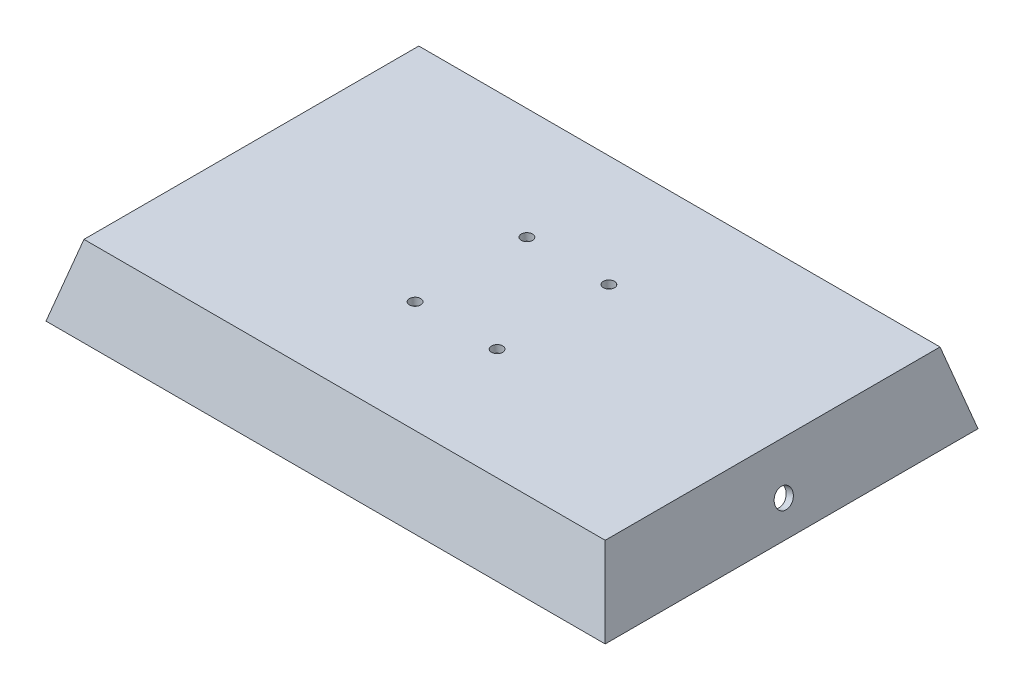
ISO-10303-21;
HEADER;
FILE_DESCRIPTION(('STEP AP214'),'2;1');
FILE_NAME('part.step','',(''),(''),'','','');
FILE_SCHEMA(('AUTOMOTIVE_DESIGN { 1 0 10303 214 1 1 1 1 }'));
ENDSEC;
DATA;
#1=APPLICATION_CONTEXT('core data for automotive mechanical design processes');
#2=APPLICATION_PROTOCOL_DEFINITION('international standard','automotive_design',2000,#1);
#3=PRODUCT_CONTEXT('',#1,'mechanical');
#4=PRODUCT('Part','Part','',(#3));
#5=PRODUCT_RELATED_PRODUCT_CATEGORY('part','',(#4));
#6=PRODUCT_DEFINITION_FORMATION('','',#4);
#7=PRODUCT_DEFINITION_CONTEXT('part definition',#1,'design');
#8=PRODUCT_DEFINITION('design','',#6,#7);
#9=PRODUCT_DEFINITION_SHAPE('','',#8);
#10=(LENGTH_UNIT() NAMED_UNIT(*) SI_UNIT(.MILLI.,.METRE.));
#11=(NAMED_UNIT(*) PLANE_ANGLE_UNIT() SI_UNIT($,.RADIAN.));
#12=(NAMED_UNIT(*) SI_UNIT($,.STERADIAN.) SOLID_ANGLE_UNIT());
#13=UNCERTAINTY_MEASURE_WITH_UNIT(LENGTH_MEASURE(1.E-05),#10,'distance_accuracy_value','');
#14=(GEOMETRIC_REPRESENTATION_CONTEXT(3) GLOBAL_UNCERTAINTY_ASSIGNED_CONTEXT((#13)) GLOBAL_UNIT_ASSIGNED_CONTEXT((#10,
#11,#12)) REPRESENTATION_CONTEXT('',''));
#15=CARTESIAN_POINT('',(0.,0.,0.));
#16=DIRECTION('',(0.,0.,1.));
#17=DIRECTION('',(1.,0.,0.));
#18=AXIS2_PLACEMENT_3D('',#15,#16,#17);
#19=CARTESIAN_POINT('',(-75.,0.,50.));
#20=DIRECTION('',(0.,0.258819045102521,0.965925826289068));
#21=DIRECTION('',(0.,-0.965925826289068,0.258819045102521));
#22=AXIS2_PLACEMENT_3D('',#19,#20,#21);
#23=PLANE('',#22);
#24=DIRECTION('',(1.,0.,0.));
#25=VECTOR('',#24,1.);
#26=CARTESIAN_POINT('',(-75.,0.,50.));
#27=LINE('',#26,#25);
#28=CARTESIAN_POINT('',(-75.,0.,50.));
#29=VERTEX_POINT('',#28);
#30=CARTESIAN_POINT('',(75.,0.,50.));
#31=VERTEX_POINT('',#30);
#32=EDGE_CURVE('E139',#29,#31,#27,.T.);
#33=ORIENTED_EDGE('',*,*,#32,.T.);
#34=DIRECTION('',(0.250562807085732,-0.935113126531029,0.250562807085732));
#35=VECTOR('',#34,1.);
#36=CARTESIAN_POINT('',(75.,0.,50.));
#37=LINE('',#36,#35);
#38=CARTESIAN_POINT('',(69.9089653438086,19.,44.9089653438087));
#39=VERTEX_POINT('',#38);
#40=EDGE_CURVE('E11',#39,#31,#37,.T.);
#41=ORIENTED_EDGE('',*,*,#40,.F.);
#42=DIRECTION('',(-1.,0.,0.));
#43=VECTOR('',#42,1.);
#44=CARTESIAN_POINT('',(-75.,19.,44.9089653438087));
#45=LINE('',#44,#43);
#46=CARTESIAN_POINT('',(-69.9089653438087,19.,44.9089653438087));
#47=VERTEX_POINT('',#46);
#48=EDGE_CURVE('E151',#47,#39,#45,.F.);
#49=ORIENTED_EDGE('',*,*,#48,.F.);
#50=DIRECTION('',(0.250562807085732,0.935113126531029,-0.250562807085732));
#51=VECTOR('',#50,1.);
#52=CARTESIAN_POINT('',(-75.,0.,50.));
#53=LINE('',#52,#51);
#54=EDGE_CURVE('E59',#47,#29,#53,.F.);
#55=ORIENTED_EDGE('',*,*,#54,.T.);
#56=EDGE_LOOP('',(#33,#41,#49,#55));
#57=FACE_BOUND('',#56,.T.);
#58=ADVANCED_FACE('F34',(#57),#23,.T.);
#59=CARTESIAN_POINT('',(75.,0.,50.));
#60=DIRECTION('',(0.965925826289068,0.258819045102521,0.));
#61=DIRECTION('',(-0.258819045102521,0.965925826289068,0.));
#62=AXIS2_PLACEMENT_3D('',#59,#60,#61);
#63=PLANE('',#62);
#64=CARTESIAN_POINT('',(72.8943534714541,7.85837982731437,0.));
#65=DIRECTION('',(0.965925826289068,0.258819045102521,0.));
#66=DIRECTION('',(-0.258819045102521,0.965925826289068,0.));
#67=AXIS2_PLACEMENT_3D('',#64,#65,#66);
#68=CIRCLE('',#67,2.5);
#69=CARTESIAN_POINT('',(72.2473058586978,10.273194393037,0.));
#70=VERTEX_POINT('',#69);
#71=EDGE_CURVE('E348',#70,#70,#68,.F.);
#72=ORIENTED_EDGE('',*,*,#71,.T.);
#73=EDGE_LOOP('',(#72));
#74=FACE_BOUND('',#73,.T.);
#75=DIRECTION('',(0.,0.,-1.));
#76=VECTOR('',#75,1.);
#77=CARTESIAN_POINT('',(75.,0.,50.));
#78=LINE('',#77,#76);
#79=CARTESIAN_POINT('',(75.,0.,-50.));
#80=VERTEX_POINT('',#79);
#81=EDGE_CURVE('E142',#31,#80,#78,.T.);
#82=ORIENTED_EDGE('',*,*,#81,.T.);
#83=DIRECTION('',(-0.250562807085732,0.935113126531029,0.250562807085732));
#84=VECTOR('',#83,1.);
#85=CARTESIAN_POINT('',(68.7218279705318,23.430456992633,-43.7218279705318));
#86=LINE('',#85,#84);
#87=CARTESIAN_POINT('',(69.9089653438086,19.,-44.9089653438087));
#88=VERTEX_POINT('',#87);
#89=EDGE_CURVE('E43',#88,#80,#86,.F.);
#90=ORIENTED_EDGE('',*,*,#89,.F.);
#91=DIRECTION('',(0.,0.,1.));
#92=VECTOR('',#91,1.);
#93=CARTESIAN_POINT('',(69.9089653438086,19.,50.));
#94=LINE('',#93,#92);
#95=EDGE_CURVE('E159',#39,#88,#94,.F.);
#96=ORIENTED_EDGE('',*,*,#95,.F.);
#97=ORIENTED_EDGE('',*,*,#40,.T.);
#98=EDGE_LOOP('',(#82,#90,#96,#97));
#99=FACE_BOUND('',#98,.T.);
#100=ADVANCED_FACE('F36',(#74,#99),#63,.T.);
#101=CARTESIAN_POINT('',(-75.,0.,-50.));
#102=DIRECTION('',(0.,0.258819045102521,-0.965925826289068));
#103=DIRECTION('',(0.,0.965925826289068,0.258819045102521));
#104=AXIS2_PLACEMENT_3D('',#101,#102,#103);
#105=PLANE('',#104);
#106=DIRECTION('',(1.,0.,0.));
#107=VECTOR('',#106,1.);
#108=CARTESIAN_POINT('',(-75.,0.,-50.));
#109=LINE('',#108,#107);
#110=CARTESIAN_POINT('',(-75.,0.,-50.));
#111=VERTEX_POINT('',#110);
#112=EDGE_CURVE('E146',#111,#80,#109,.T.);
#113=ORIENTED_EDGE('',*,*,#112,.F.);
#114=DIRECTION('',(-0.250562807085732,-0.935113126531029,-0.250562807085732));
#115=VECTOR('',#114,1.);
#116=CARTESIAN_POINT('',(-68.7218279705318,23.430456992633,-43.7218279705318));
#117=LINE('',#116,#115);
#118=CARTESIAN_POINT('',(-69.9089653438087,19.,-44.9089653438087));
#119=VERTEX_POINT('',#118);
#120=EDGE_CURVE('E154',#119,#111,#117,.T.);
#121=ORIENTED_EDGE('',*,*,#120,.F.);
#122=DIRECTION('',(1.,0.,0.));
#123=VECTOR('',#122,1.);
#124=CARTESIAN_POINT('',(-75.,19.,-44.9089653438087));
#125=LINE('',#124,#123);
#126=EDGE_CURVE('E160',#119,#88,#125,.T.);
#127=ORIENTED_EDGE('',*,*,#126,.T.);
#128=ORIENTED_EDGE('',*,*,#89,.T.);
#129=EDGE_LOOP('',(#113,#121,#127,#128));
#130=FACE_BOUND('',#129,.T.);
#131=ADVANCED_FACE('F172',(#130),#105,.T.);
#132=CARTESIAN_POINT('',(-75.,0.,50.));
#133=DIRECTION('',(-0.965925826289068,0.258819045102521,0.));
#134=DIRECTION('',(-0.258819045102521,-0.965925826289068,0.));
#135=AXIS2_PLACEMENT_3D('',#132,#133,#134);
#136=PLANE('',#135);
#137=CARTESIAN_POINT('',(-72.4544826719043,9.5,35.));
#138=DIRECTION('',(-0.965925826289068,0.258819045102521,0.));
#139=DIRECTION('',(0.258819045102521,0.965925826289068,0.));
#140=AXIS2_PLACEMENT_3D('',#137,#138,#139);
#141=ELLIPSE('',#140,3.62346663143529,3.5);
#142=CARTESIAN_POINT('',(-71.5166604983954,13.,35.));
#143=VERTEX_POINT('',#142);
#144=EDGE_CURVE('E360',#143,#143,#141,.F.);
#145=ORIENTED_EDGE('',*,*,#144,.T.);
#146=EDGE_LOOP('',(#145));
#147=FACE_BOUND('',#146,.T.);
#148=CARTESIAN_POINT('',(-72.4544826719043,9.49999999999999,-35.));
#149=DIRECTION('',(-0.965925826289068,0.258819045102521,0.));
#150=DIRECTION('',(0.258819045102521,0.965925826289068,0.));
#151=AXIS2_PLACEMENT_3D('',#148,#149,#150);
#152=ELLIPSE('',#151,3.62346663143529,3.5);
#153=CARTESIAN_POINT('',(-71.5166604983954,13.,-35.));
#154=VERTEX_POINT('',#153);
#155=EDGE_CURVE('E349',#154,#154,#152,.F.);
#156=ORIENTED_EDGE('',*,*,#155,.T.);
#157=EDGE_LOOP('',(#156));
#158=FACE_BOUND('',#157,.T.);
#159=DIRECTION('',(0.,0.,-1.));
#160=VECTOR('',#159,1.);
#161=CARTESIAN_POINT('',(-75.,0.,50.));
#162=LINE('',#161,#160);
#163=EDGE_CURVE('E149',#29,#111,#162,.T.);
#164=ORIENTED_EDGE('',*,*,#163,.F.);
#165=ORIENTED_EDGE('',*,*,#54,.F.);
#166=DIRECTION('',(0.,0.,-1.));
#167=VECTOR('',#166,1.);
#168=CARTESIAN_POINT('',(-69.9089653438087,19.,50.));
#169=LINE('',#168,#167);
#170=EDGE_CURVE('E38',#47,#119,#169,.T.);
#171=ORIENTED_EDGE('',*,*,#170,.T.);
#172=ORIENTED_EDGE('',*,*,#120,.T.);
#173=EDGE_LOOP('',(#164,#165,#171,#172));
#174=FACE_BOUND('',#173,.T.);
#175=ADVANCED_FACE('F165',(#147,#158,#174),#136,.T.);
#176=CARTESIAN_POINT('',(0.,19.,0.));
#177=DIRECTION('',(0.,1.,0.));
#178=DIRECTION('',(0.,0.,1.));
#179=AXIS2_PLACEMENT_3D('',#176,#177,#178);
#180=PLANE('',#179);
#181=CARTESIAN_POINT('',(-11.,19.,15.));
#182=DIRECTION('',(0.,-1.,0.));
#183=DIRECTION('',(0.,0.,1.));
#184=AXIS2_PLACEMENT_3D('',#181,#182,#183);
#185=CIRCLE('',#184,1.5);
#186=CARTESIAN_POINT('',(-11.,19.,16.5));
#187=VERTEX_POINT('',#186);
#188=EDGE_CURVE('E371',#187,#187,#185,.T.);
#189=ORIENTED_EDGE('',*,*,#188,.T.);
#190=EDGE_LOOP('',(#189));
#191=FACE_BOUND('',#190,.T.);
#192=CARTESIAN_POINT('',(11.,19.,-15.));
#193=DIRECTION('',(0.,-1.,0.));
#194=DIRECTION('',(0.,0.,1.));
#195=AXIS2_PLACEMENT_3D('',#192,#193,#194);
#196=CIRCLE('',#195,1.5);
#197=CARTESIAN_POINT('',(11.,19.,-13.5));
#198=VERTEX_POINT('',#197);
#199=EDGE_CURVE('E378',#198,#198,#196,.T.);
#200=ORIENTED_EDGE('',*,*,#199,.T.);
#201=EDGE_LOOP('',(#200));
#202=FACE_BOUND('',#201,.T.);
#203=CARTESIAN_POINT('',(-11.,19.,-15.));
#204=DIRECTION('',(0.,-1.,0.));
#205=DIRECTION('',(0.,0.,-1.));
#206=AXIS2_PLACEMENT_3D('',#203,#204,#205);
#207=CIRCLE('',#206,1.5);
#208=CARTESIAN_POINT('',(-11.,19.,-16.5));
#209=VERTEX_POINT('',#208);
#210=EDGE_CURVE('E365',#209,#209,#207,.T.);
#211=ORIENTED_EDGE('',*,*,#210,.T.);
#212=EDGE_LOOP('',(#211));
#213=FACE_BOUND('',#212,.T.);
#214=CARTESIAN_POINT('',(11.,19.,15.));
#215=DIRECTION('',(0.,-1.,0.));
#216=DIRECTION('',(0.,0.,-1.));
#217=AXIS2_PLACEMENT_3D('',#214,#215,#216);
#218=CIRCLE('',#217,1.5);
#219=CARTESIAN_POINT('',(11.,19.,13.5));
#220=VERTEX_POINT('',#219);
#221=EDGE_CURVE('E134',#220,#220,#218,.T.);
#222=ORIENTED_EDGE('',*,*,#221,.T.);
#223=EDGE_LOOP('',(#222));
#224=FACE_BOUND('',#223,.T.);
#225=ORIENTED_EDGE('',*,*,#48,.T.);
#226=ORIENTED_EDGE('',*,*,#95,.T.);
#227=ORIENTED_EDGE('',*,*,#126,.F.);
#228=ORIENTED_EDGE('',*,*,#170,.F.);
#229=EDGE_LOOP('',(#225,#226,#227,#228));
#230=FACE_BOUND('',#229,.T.);
#231=ADVANCED_FACE('F168',(#191,#202,#213,#224,#230),#180,.T.);
#232=CARTESIAN_POINT('',(0.,0.,0.));
#233=DIRECTION('',(0.,1.,0.));
#234=DIRECTION('',(0.,0.,1.));
#235=AXIS2_PLACEMENT_3D('',#232,#233,#234);
#236=PLANE('',#235);
#237=DIRECTION('',(0.,0.,-1.));
#238=VECTOR('',#237,1.);
#239=CARTESIAN_POINT('',(-72.9294476391798,0.,50.));
#240=LINE('',#239,#238);
#241=CARTESIAN_POINT('',(-72.9294476391798,0.,47.9294476391798));
#242=VERTEX_POINT('',#241);
#243=CARTESIAN_POINT('',(-72.9294476391798,0.,-47.9294476391798));
#244=VERTEX_POINT('',#243);
#245=EDGE_CURVE('E123',#242,#244,#240,.T.);
#246=ORIENTED_EDGE('',*,*,#245,.F.);
#247=DIRECTION('',(-1.,0.,0.));
#248=VECTOR('',#247,1.);
#249=CARTESIAN_POINT('',(-75.,0.,47.9294476391798));
#250=LINE('',#249,#248);
#251=CARTESIAN_POINT('',(72.9294476391798,0.,47.9294476391798));
#252=VERTEX_POINT('',#251);
#253=EDGE_CURVE('E110',#242,#252,#250,.F.);
#254=ORIENTED_EDGE('',*,*,#253,.T.);
#255=DIRECTION('',(0.,0.,1.));
#256=VECTOR('',#255,1.);
#257=CARTESIAN_POINT('',(72.9294476391798,0.,50.));
#258=LINE('',#257,#256);
#259=CARTESIAN_POINT('',(72.9294476391798,0.,-47.9294476391798));
#260=VERTEX_POINT('',#259);
#261=EDGE_CURVE('E133',#252,#260,#258,.F.);
#262=ORIENTED_EDGE('',*,*,#261,.T.);
#263=DIRECTION('',(1.,0.,0.));
#264=VECTOR('',#263,1.);
#265=CARTESIAN_POINT('',(-75.,0.,-47.9294476391798));
#266=LINE('',#265,#264);
#267=EDGE_CURVE('E51',#244,#260,#266,.T.);
#268=ORIENTED_EDGE('',*,*,#267,.F.);
#269=EDGE_LOOP('',(#246,#254,#262,#268));
#270=FACE_BOUND('',#269,.T.);
#271=ORIENTED_EDGE('',*,*,#32,.F.);
#272=ORIENTED_EDGE('',*,*,#163,.T.);
#273=ORIENTED_EDGE('',*,*,#112,.T.);
#274=ORIENTED_EDGE('',*,*,#81,.F.);
#275=EDGE_LOOP('',(#271,#272,#273,#274));
#276=FACE_BOUND('',#275,.T.);
#277=ADVANCED_FACE('F175',(#270,#276),#236,.F.);
#278=CARTESIAN_POINT('',(-75.,-0.517638090205043,48.0681483474219));
#279=DIRECTION('',(0.,0.258819045102521,0.965925826289068));
#280=DIRECTION('',(0.,-0.965925826289068,0.258819045102521));
#281=AXIS2_PLACEMENT_3D('',#278,#279,#280);
#282=PLANE('',#281);
#283=ORIENTED_EDGE('',*,*,#253,.F.);
#284=DIRECTION('',(0.250562807085732,0.935113126531029,-0.250562807085732));
#285=VECTOR('',#284,1.);
#286=CARTESIAN_POINT('',(-73.1894333175248,-0.970279760823833,48.1894333175248));
#287=LINE('',#286,#285);
#288=CARTESIAN_POINT('',(-68.3743113678507,17.,43.3743113678507));
#289=VERTEX_POINT('',#288);
#290=EDGE_CURVE('E103',#289,#242,#287,.F.);
#291=ORIENTED_EDGE('',*,*,#290,.F.);
#292=DIRECTION('',(-1.,0.,0.));
#293=VECTOR('',#292,1.);
#294=CARTESIAN_POINT('',(-75.,17.,43.3743113678507));
#295=LINE('',#294,#293);
#296=CARTESIAN_POINT('',(68.3743113678507,17.,43.3743113678507));
#297=VERTEX_POINT('',#296);
#298=EDGE_CURVE('E107',#289,#297,#295,.F.);
#299=ORIENTED_EDGE('',*,*,#298,.T.);
#300=DIRECTION('',(0.250562807085732,-0.935113126531029,0.250562807085732));
#301=VECTOR('',#300,1.);
#302=CARTESIAN_POINT('',(73.1894333175248,-0.970279760823833,48.1894333175248));
#303=LINE('',#302,#301);
#304=EDGE_CURVE('E143',#297,#252,#303,.T.);
#305=ORIENTED_EDGE('',*,*,#304,.T.);
#306=EDGE_LOOP('',(#283,#291,#299,#305));
#307=FACE_BOUND('',#306,.T.);
#308=ADVANCED_FACE('F105',(#307),#282,.F.);
#309=CARTESIAN_POINT('',(73.0681483474218,-0.517638090205043,50.));
#310=DIRECTION('',(0.965925826289068,0.258819045102521,0.));
#311=DIRECTION('',(-0.258819045102521,0.965925826289068,0.));
#312=AXIS2_PLACEMENT_3D('',#309,#310,#311);
#313=PLANE('',#312);
#314=CARTESIAN_POINT('',(70.9625018188759,7.34074173710933,0.));
#315=DIRECTION('',(-0.965925826289068,-0.258819045102521,0.));
#316=DIRECTION('',(0.258819045102521,-0.965925826289068,0.));
#317=AXIS2_PLACEMENT_3D('',#314,#315,#316);
#318=CIRCLE('',#317,2.5);
#319=CARTESIAN_POINT('',(71.6095494316322,4.92592717138665,0.));
#320=VERTEX_POINT('',#319);
#321=EDGE_CURVE('E345',#320,#320,#318,.T.);
#322=ORIENTED_EDGE('',*,*,#321,.F.);
#323=EDGE_LOOP('',(#322));
#324=FACE_BOUND('',#323,.T.);
#325=ORIENTED_EDGE('',*,*,#261,.F.);
#326=ORIENTED_EDGE('',*,*,#304,.F.);
#327=DIRECTION('',(0.,0.,1.));
#328=VECTOR('',#327,1.);
#329=CARTESIAN_POINT('',(68.3743113678507,17.,50.));
#330=LINE('',#329,#328);
#331=CARTESIAN_POINT('',(68.3743113678507,17.,-43.3743113678507));
#332=VERTEX_POINT('',#331);
#333=EDGE_CURVE('E122',#297,#332,#330,.F.);
#334=ORIENTED_EDGE('',*,*,#333,.T.);
#335=DIRECTION('',(-0.250562807085732,0.935113126531029,0.250562807085732));
#336=VECTOR('',#335,1.);
#337=CARTESIAN_POINT('',(66.9112612880566,22.4601772318092,-41.9112612880567));
#338=LINE('',#337,#336);
#339=EDGE_CURVE('E387',#332,#260,#338,.F.);
#340=ORIENTED_EDGE('',*,*,#339,.T.);
#341=EDGE_LOOP('',(#325,#326,#334,#340));
#342=FACE_BOUND('',#341,.T.);
#343=ADVANCED_FACE('F219',(#324,#342),#313,.F.);
#344=CARTESIAN_POINT('',(-75.,-0.517638090205043,-48.0681483474219));
#345=DIRECTION('',(0.,0.258819045102521,-0.965925826289068));
#346=DIRECTION('',(0.,0.965925826289068,0.258819045102521));
#347=AXIS2_PLACEMENT_3D('',#344,#345,#346);
#348=PLANE('',#347);
#349=ORIENTED_EDGE('',*,*,#267,.T.);
#350=ORIENTED_EDGE('',*,*,#339,.F.);
#351=DIRECTION('',(1.,0.,0.));
#352=VECTOR('',#351,1.);
#353=CARTESIAN_POINT('',(-75.,17.,-43.3743113678507));
#354=LINE('',#353,#352);
#355=CARTESIAN_POINT('',(-68.3743113678507,17.,-43.3743113678507));
#356=VERTEX_POINT('',#355);
#357=EDGE_CURVE('E127',#356,#332,#354,.T.);
#358=ORIENTED_EDGE('',*,*,#357,.F.);
#359=DIRECTION('',(-0.250562807085732,-0.935113126531029,-0.250562807085732));
#360=VECTOR('',#359,1.);
#361=CARTESIAN_POINT('',(-66.9112612880567,22.4601772318092,-41.9112612880567));
#362=LINE('',#361,#360);
#363=EDGE_CURVE('E115',#356,#244,#362,.T.);
#364=ORIENTED_EDGE('',*,*,#363,.T.);
#365=EDGE_LOOP('',(#349,#350,#358,#364));
#366=FACE_BOUND('',#365,.T.);
#367=ADVANCED_FACE('F226',(#366),#348,.F.);
#368=CARTESIAN_POINT('',(-73.0681483474219,-0.517638090205043,50.));
#369=DIRECTION('',(-0.965925826289068,0.258819045102521,0.));
#370=DIRECTION('',(-0.258819045102521,-0.965925826289068,0.));
#371=AXIS2_PLACEMENT_3D('',#368,#369,#370);
#372=PLANE('',#371);
#373=CARTESIAN_POINT('',(-70.3839303110842,9.5,35.));
#374=DIRECTION('',(-0.965925826289068,0.258819045102521,0.));
#375=DIRECTION('',(0.258819045102521,0.965925826289068,0.));
#376=AXIS2_PLACEMENT_3D('',#373,#374,#375);
#377=ELLIPSE('',#376,3.62346663143529,3.5);
#378=CARTESIAN_POINT('',(-69.4461081375752,13.,35.));
#379=VERTEX_POINT('',#378);
#380=EDGE_CURVE('E356',#379,#379,#377,.F.);
#381=ORIENTED_EDGE('',*,*,#380,.F.);
#382=EDGE_LOOP('',(#381));
#383=FACE_BOUND('',#382,.T.);
#384=CARTESIAN_POINT('',(-70.3839303110842,9.49999999999999,-35.));
#385=DIRECTION('',(-0.965925826289068,0.258819045102521,0.));
#386=DIRECTION('',(0.258819045102521,0.965925826289068,0.));
#387=AXIS2_PLACEMENT_3D('',#384,#385,#386);
#388=ELLIPSE('',#387,3.62346663143529,3.5);
#389=CARTESIAN_POINT('',(-69.4461081375752,13.,-35.));
#390=VERTEX_POINT('',#389);
#391=EDGE_CURVE('E352',#390,#390,#388,.F.);
#392=ORIENTED_EDGE('',*,*,#391,.F.);
#393=EDGE_LOOP('',(#392));
#394=FACE_BOUND('',#393,.T.);
#395=ORIENTED_EDGE('',*,*,#245,.T.);
#396=ORIENTED_EDGE('',*,*,#363,.F.);
#397=DIRECTION('',(0.,0.,-1.));
#398=VECTOR('',#397,1.);
#399=CARTESIAN_POINT('',(-68.3743113678507,17.,50.));
#400=LINE('',#399,#398);
#401=EDGE_CURVE('E116',#289,#356,#400,.T.);
#402=ORIENTED_EDGE('',*,*,#401,.F.);
#403=ORIENTED_EDGE('',*,*,#290,.T.);
#404=EDGE_LOOP('',(#395,#396,#402,#403));
#405=FACE_BOUND('',#404,.T.);
#406=ADVANCED_FACE('F125',(#383,#394,#405),#372,.F.);
#407=CARTESIAN_POINT('',(0.,17.,0.));
#408=DIRECTION('',(0.,1.,0.));
#409=DIRECTION('',(0.,0.,1.));
#410=AXIS2_PLACEMENT_3D('',#407,#408,#409);
#411=PLANE('',#410);
#412=CARTESIAN_POINT('',(-11.,17.,15.));
#413=DIRECTION('',(0.,-1.,0.));
#414=DIRECTION('',(0.,0.,1.));
#415=AXIS2_PLACEMENT_3D('',#412,#413,#414);
#416=CIRCLE('',#415,1.5);
#417=CARTESIAN_POINT('',(-11.,17.,16.5));
#418=VERTEX_POINT('',#417);
#419=EDGE_CURVE('E375',#418,#418,#416,.T.);
#420=ORIENTED_EDGE('',*,*,#419,.F.);
#421=EDGE_LOOP('',(#420));
#422=FACE_BOUND('',#421,.T.);
#423=CARTESIAN_POINT('',(11.,17.,-15.));
#424=DIRECTION('',(0.,-1.,0.));
#425=DIRECTION('',(0.,0.,1.));
#426=AXIS2_PLACEMENT_3D('',#423,#424,#425);
#427=CIRCLE('',#426,1.5);
#428=CARTESIAN_POINT('',(11.,17.,-13.5));
#429=VERTEX_POINT('',#428);
#430=EDGE_CURVE('E368',#429,#429,#427,.T.);
#431=ORIENTED_EDGE('',*,*,#430,.F.);
#432=EDGE_LOOP('',(#431));
#433=FACE_BOUND('',#432,.T.);
#434=CARTESIAN_POINT('',(-11.,17.,-15.));
#435=DIRECTION('',(0.,-1.,0.));
#436=DIRECTION('',(0.,0.,-1.));
#437=AXIS2_PLACEMENT_3D('',#434,#435,#436);
#438=CIRCLE('',#437,1.5);
#439=CARTESIAN_POINT('',(-11.,17.,-16.5));
#440=VERTEX_POINT('',#439);
#441=EDGE_CURVE('E359',#440,#440,#438,.T.);
#442=ORIENTED_EDGE('',*,*,#441,.F.);
#443=EDGE_LOOP('',(#442));
#444=FACE_BOUND('',#443,.T.);
#445=CARTESIAN_POINT('',(11.,17.,15.));
#446=DIRECTION('',(0.,-1.,0.));
#447=DIRECTION('',(0.,0.,-1.));
#448=AXIS2_PLACEMENT_3D('',#445,#446,#447);
#449=CIRCLE('',#448,1.5);
#450=CARTESIAN_POINT('',(11.,17.,13.5));
#451=VERTEX_POINT('',#450);
#452=EDGE_CURVE('E374',#451,#451,#449,.T.);
#453=ORIENTED_EDGE('',*,*,#452,.F.);
#454=EDGE_LOOP('',(#453));
#455=FACE_BOUND('',#454,.T.);
#456=ORIENTED_EDGE('',*,*,#298,.F.);
#457=ORIENTED_EDGE('',*,*,#401,.T.);
#458=ORIENTED_EDGE('',*,*,#357,.T.);
#459=ORIENTED_EDGE('',*,*,#333,.F.);
#460=EDGE_LOOP('',(#456,#457,#458,#459));
#461=FACE_BOUND('',#460,.T.);
#462=ADVANCED_FACE('F120',(#422,#433,#444,#455,#461),#411,.F.);
#463=CARTESIAN_POINT('',(11.,19.,15.));
#464=DIRECTION('',(0.,-1.,0.));
#465=DIRECTION('',(0.,0.,-1.));
#466=AXIS2_PLACEMENT_3D('',#463,#464,#465);
#467=CYLINDRICAL_SURFACE('',#466,1.5);
#468=ORIENTED_EDGE('',*,*,#221,.F.);
#469=EDGE_LOOP('',(#468));
#470=FACE_BOUND('',#469,.T.);
#471=ORIENTED_EDGE('',*,*,#452,.T.);
#472=EDGE_LOOP('',(#471));
#473=FACE_BOUND('',#472,.T.);
#474=ADVANCED_FACE('F246',(#470,#473),#467,.F.);
#475=CARTESIAN_POINT('',(-11.,19.,-15.));
#476=DIRECTION('',(0.,-1.,0.));
#477=DIRECTION('',(0.,0.,-1.));
#478=AXIS2_PLACEMENT_3D('',#475,#476,#477);
#479=CYLINDRICAL_SURFACE('',#478,1.5);
#480=ORIENTED_EDGE('',*,*,#210,.F.);
#481=EDGE_LOOP('',(#480));
#482=FACE_BOUND('',#481,.T.);
#483=ORIENTED_EDGE('',*,*,#441,.T.);
#484=EDGE_LOOP('',(#483));
#485=FACE_BOUND('',#484,.T.);
#486=ADVANCED_FACE('F254',(#482,#485),#479,.F.);
#487=CARTESIAN_POINT('',(11.,19.,-15.));
#488=DIRECTION('',(0.,-1.,0.));
#489=DIRECTION('',(0.,0.,-1.));
#490=AXIS2_PLACEMENT_3D('',#487,#488,#489);
#491=CYLINDRICAL_SURFACE('',#490,1.5);
#492=ORIENTED_EDGE('',*,*,#199,.F.);
#493=EDGE_LOOP('',(#492));
#494=FACE_BOUND('',#493,.T.);
#495=ORIENTED_EDGE('',*,*,#430,.T.);
#496=EDGE_LOOP('',(#495));
#497=FACE_BOUND('',#496,.T.);
#498=ADVANCED_FACE('F262',(#494,#497),#491,.F.);
#499=CARTESIAN_POINT('',(-11.,19.,15.));
#500=DIRECTION('',(0.,-1.,0.));
#501=DIRECTION('',(0.,0.,-1.));
#502=AXIS2_PLACEMENT_3D('',#499,#500,#501);
#503=CYLINDRICAL_SURFACE('',#502,1.5);
#504=ORIENTED_EDGE('',*,*,#188,.F.);
#505=EDGE_LOOP('',(#504));
#506=FACE_BOUND('',#505,.T.);
#507=ORIENTED_EDGE('',*,*,#419,.T.);
#508=EDGE_LOOP('',(#507));
#509=FACE_BOUND('',#508,.T.);
#510=ADVANCED_FACE('F270',(#506,#509),#503,.F.);
#511=CARTESIAN_POINT('',(-75.001,9.49999999999999,-35.));
#512=DIRECTION('',(1.,0.,0.));
#513=DIRECTION('',(0.,0.,-1.));
#514=AXIS2_PLACEMENT_3D('',#511,#512,#513);
#515=CYLINDRICAL_SURFACE('',#514,3.5);
#516=ORIENTED_EDGE('',*,*,#155,.F.);
#517=EDGE_LOOP('',(#516));
#518=FACE_BOUND('',#517,.T.);
#519=ORIENTED_EDGE('',*,*,#391,.T.);
#520=EDGE_LOOP('',(#519));
#521=FACE_BOUND('',#520,.T.);
#522=ADVANCED_FACE('F277',(#518,#521),#515,.F.);
#523=CARTESIAN_POINT('',(-75.001,9.5,35.));
#524=DIRECTION('',(1.,0.,0.));
#525=DIRECTION('',(0.,0.,-1.));
#526=AXIS2_PLACEMENT_3D('',#523,#524,#525);
#527=CYLINDRICAL_SURFACE('',#526,3.5);
#528=ORIENTED_EDGE('',*,*,#144,.F.);
#529=EDGE_LOOP('',(#528));
#530=FACE_BOUND('',#529,.T.);
#531=ORIENTED_EDGE('',*,*,#380,.T.);
#532=EDGE_LOOP('',(#531));
#533=FACE_BOUND('',#532,.T.);
#534=ADVANCED_FACE('F284',(#530,#533),#527,.F.);
#535=CARTESIAN_POINT('',(77.6443534714541,9.13113849136221,0.));
#536=DIRECTION('',(-0.965925826289068,-0.258819045102521,0.));
#537=DIRECTION('',(0.258819045102521,-0.965925826289068,0.));
#538=AXIS2_PLACEMENT_3D('',#535,#536,#537);
#539=CYLINDRICAL_SURFACE('',#538,2.5);
#540=ORIENTED_EDGE('',*,*,#321,.T.);
#541=EDGE_LOOP('',(#540));
#542=FACE_BOUND('',#541,.T.);
#543=ORIENTED_EDGE('',*,*,#71,.F.);
#544=EDGE_LOOP('',(#543));
#545=FACE_BOUND('',#544,.T.);
#546=ADVANCED_FACE('F292',(#542,#545),#539,.F.);
#547=CLOSED_SHELL('',(#58,#100,#131,#175,#231,#277,#308,#343,#367,#406,#462,#474,#486,#498,#510,
#522,#534,#546));
#548=MANIFOLD_SOLID_BREP('B2',#547);
#549=ADVANCED_BREP_SHAPE_REPRESENTATION('',(#18,#548),#14);
#550=SHAPE_DEFINITION_REPRESENTATION(#9,#549);
ENDSEC;
END-ISO-10303-21;
